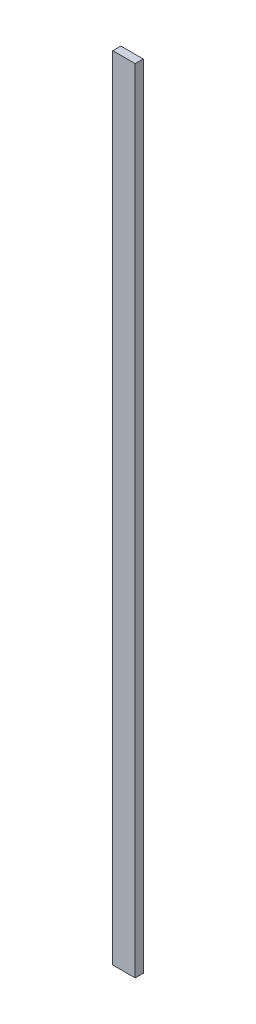
ISO-10303-21;
HEADER;
FILE_DESCRIPTION(('STEP AP214'),'2;1');
FILE_NAME('part.step','',(''),(''),'','','');
FILE_SCHEMA(('AUTOMOTIVE_DESIGN { 1 0 10303 214 1 1 1 1 }'));
ENDSEC;
DATA;
#1=APPLICATION_CONTEXT('core data for automotive mechanical design processes');
#2=APPLICATION_PROTOCOL_DEFINITION('international standard','automotive_design',2000,#1);
#3=PRODUCT_CONTEXT('',#1,'mechanical');
#4=PRODUCT('Part','Part','',(#3));
#5=PRODUCT_RELATED_PRODUCT_CATEGORY('part','',(#4));
#6=PRODUCT_DEFINITION_FORMATION('','',#4);
#7=PRODUCT_DEFINITION_CONTEXT('part definition',#1,'design');
#8=PRODUCT_DEFINITION('design','',#6,#7);
#9=PRODUCT_DEFINITION_SHAPE('','',#8);
#10=(LENGTH_UNIT() NAMED_UNIT(*) SI_UNIT(.MILLI.,.METRE.));
#11=(NAMED_UNIT(*) PLANE_ANGLE_UNIT() SI_UNIT($,.RADIAN.));
#12=(NAMED_UNIT(*) SI_UNIT($,.STERADIAN.) SOLID_ANGLE_UNIT());
#13=UNCERTAINTY_MEASURE_WITH_UNIT(LENGTH_MEASURE(1.E-05),#10,'distance_accuracy_value','');
#14=(GEOMETRIC_REPRESENTATION_CONTEXT(3) GLOBAL_UNCERTAINTY_ASSIGNED_CONTEXT((#13)) GLOBAL_UNIT_ASSIGNED_CONTEXT((#10,
#11,#12)) REPRESENTATION_CONTEXT('',''));
#15=CARTESIAN_POINT('',(0.,0.,0.));
#16=DIRECTION('',(0.,0.,1.));
#17=DIRECTION('',(1.,0.,0.));
#18=AXIS2_PLACEMENT_3D('',#15,#16,#17);
#19=CARTESIAN_POINT('',(25.4,-896.14375,18.25625));
#20=DIRECTION('',(-1.,0.,0.));
#21=DIRECTION('',(0.,0.,1.));
#22=AXIS2_PLACEMENT_3D('',#19,#20,#21);
#23=PLANE('',#22);
#24=DIRECTION('',(0.,1.,0.));
#25=VECTOR('',#24,1.);
#26=CARTESIAN_POINT('',(25.4,-896.14375,0.));
#27=LINE('',#26,#25);
#28=CARTESIAN_POINT('',(25.4,-896.14375,0.));
#29=VERTEX_POINT('',#28);
#30=CARTESIAN_POINT('',(25.4,896.14375,0.));
#31=VERTEX_POINT('',#30);
#32=EDGE_CURVE('E107',#29,#31,#27,.T.);
#33=ORIENTED_EDGE('',*,*,#32,.T.);
#34=DIRECTION('',(0.,0.,-1.));
#35=VECTOR('',#34,1.);
#36=CARTESIAN_POINT('',(25.4,896.14375,18.25625));
#37=LINE('',#36,#35);
#38=CARTESIAN_POINT('',(25.4,896.14375,18.25625));
#39=VERTEX_POINT('',#38);
#40=EDGE_CURVE('E11',#39,#31,#37,.T.);
#41=ORIENTED_EDGE('',*,*,#40,.F.);
#42=DIRECTION('',(0.,1.,0.));
#43=VECTOR('',#42,1.);
#44=CARTESIAN_POINT('',(25.4,-896.14375,18.25625));
#45=LINE('',#44,#43);
#46=CARTESIAN_POINT('',(25.4,-896.14375,18.25625));
#47=VERTEX_POINT('',#46);
#48=EDGE_CURVE('E91',#47,#39,#45,.T.);
#49=ORIENTED_EDGE('',*,*,#48,.F.);
#50=DIRECTION('',(0.,0.,-1.));
#51=VECTOR('',#50,1.);
#52=CARTESIAN_POINT('',(25.4,-896.14375,18.25625));
#53=LINE('',#52,#51);
#54=EDGE_CURVE('E103',#47,#29,#53,.T.);
#55=ORIENTED_EDGE('',*,*,#54,.T.);
#56=EDGE_LOOP('',(#33,#41,#49,#55));
#57=FACE_BOUND('',#56,.T.);
#58=ADVANCED_FACE('F39',(#57),#23,.F.);
#59=CARTESIAN_POINT('',(-25.4,896.14375,18.25625));
#60=DIRECTION('',(0.,-1.,0.));
#61=DIRECTION('',(0.,0.,-1.));
#62=AXIS2_PLACEMENT_3D('',#59,#60,#61);
#63=PLANE('',#62);
#64=DIRECTION('',(-1.,0.,0.));
#65=VECTOR('',#64,1.);
#66=CARTESIAN_POINT('',(-25.4,896.14375,0.));
#67=LINE('',#66,#65);
#68=CARTESIAN_POINT('',(-25.4,896.14375,0.));
#69=VERTEX_POINT('',#68);
#70=EDGE_CURVE('E96',#31,#69,#67,.T.);
#71=ORIENTED_EDGE('',*,*,#70,.T.);
#72=DIRECTION('',(0.,0.,-1.));
#73=VECTOR('',#72,1.);
#74=CARTESIAN_POINT('',(-25.4,896.14375,18.25625));
#75=LINE('',#74,#73);
#76=CARTESIAN_POINT('',(-25.4,896.14375,18.25625));
#77=VERTEX_POINT('',#76);
#78=EDGE_CURVE('E48',#77,#69,#75,.T.);
#79=ORIENTED_EDGE('',*,*,#78,.F.);
#80=DIRECTION('',(-1.,0.,0.));
#81=VECTOR('',#80,1.);
#82=CARTESIAN_POINT('',(-25.4,896.14375,18.25625));
#83=LINE('',#82,#81);
#84=EDGE_CURVE('E86',#39,#77,#83,.T.);
#85=ORIENTED_EDGE('',*,*,#84,.F.);
#86=ORIENTED_EDGE('',*,*,#40,.T.);
#87=EDGE_LOOP('',(#71,#79,#85,#86));
#88=FACE_BOUND('',#87,.T.);
#89=ADVANCED_FACE('F95',(#88),#63,.F.);
#90=CARTESIAN_POINT('',(-25.4,-896.14375,18.25625));
#91=DIRECTION('',(1.,0.,0.));
#92=DIRECTION('',(0.,0.,-1.));
#93=AXIS2_PLACEMENT_3D('',#90,#91,#92);
#94=PLANE('',#93);
#95=DIRECTION('',(0.,-1.,0.));
#96=VECTOR('',#95,1.);
#97=CARTESIAN_POINT('',(-25.4,-896.14375,0.));
#98=LINE('',#97,#96);
#99=CARTESIAN_POINT('',(-25.4,-896.14375,0.));
#100=VERTEX_POINT('',#99);
#101=EDGE_CURVE('E73',#69,#100,#98,.T.);
#102=ORIENTED_EDGE('',*,*,#101,.T.);
#103=DIRECTION('',(0.,0.,-1.));
#104=VECTOR('',#103,1.);
#105=CARTESIAN_POINT('',(-25.4,-896.14375,18.25625));
#106=LINE('',#105,#104);
#107=CARTESIAN_POINT('',(-25.4,-896.14375,18.25625));
#108=VERTEX_POINT('',#107);
#109=EDGE_CURVE('E98',#108,#100,#106,.T.);
#110=ORIENTED_EDGE('',*,*,#109,.F.);
#111=DIRECTION('',(0.,-1.,0.));
#112=VECTOR('',#111,1.);
#113=CARTESIAN_POINT('',(-25.4,-896.14375,18.25625));
#114=LINE('',#113,#112);
#115=EDGE_CURVE('E89',#77,#108,#114,.T.);
#116=ORIENTED_EDGE('',*,*,#115,.F.);
#117=ORIENTED_EDGE('',*,*,#78,.T.);
#118=EDGE_LOOP('',(#102,#110,#116,#117));
#119=FACE_BOUND('',#118,.T.);
#120=ADVANCED_FACE('F99',(#119),#94,.F.);
#121=CARTESIAN_POINT('',(-25.4,-896.14375,18.25625));
#122=DIRECTION('',(0.,1.,0.));
#123=DIRECTION('',(0.,0.,1.));
#124=AXIS2_PLACEMENT_3D('',#121,#122,#123);
#125=PLANE('',#124);
#126=DIRECTION('',(1.,0.,0.));
#127=VECTOR('',#126,1.);
#128=CARTESIAN_POINT('',(-25.4,-896.14375,0.));
#129=LINE('',#128,#127);
#130=EDGE_CURVE('E79',#100,#29,#129,.T.);
#131=ORIENTED_EDGE('',*,*,#130,.T.);
#132=ORIENTED_EDGE('',*,*,#54,.F.);
#133=DIRECTION('',(1.,0.,0.));
#134=VECTOR('',#133,1.);
#135=CARTESIAN_POINT('',(-25.4,-896.14375,18.25625));
#136=LINE('',#135,#134);
#137=EDGE_CURVE('E56',#108,#47,#136,.T.);
#138=ORIENTED_EDGE('',*,*,#137,.F.);
#139=ORIENTED_EDGE('',*,*,#109,.T.);
#140=EDGE_LOOP('',(#131,#132,#138,#139));
#141=FACE_BOUND('',#140,.T.);
#142=ADVANCED_FACE('F120',(#141),#125,.F.);
#143=CARTESIAN_POINT('',(0.,0.,18.25625));
#144=DIRECTION('',(0.,0.,-1.));
#145=DIRECTION('',(-1.,0.,0.));
#146=AXIS2_PLACEMENT_3D('',#143,#144,#145);
#147=PLANE('',#146);
#148=ORIENTED_EDGE('',*,*,#48,.T.);
#149=ORIENTED_EDGE('',*,*,#84,.T.);
#150=ORIENTED_EDGE('',*,*,#115,.T.);
#151=ORIENTED_EDGE('',*,*,#137,.T.);
#152=EDGE_LOOP('',(#148,#149,#150,#151));
#153=FACE_BOUND('',#152,.T.);
#154=ADVANCED_FACE('F87',(#153),#147,.F.);
#155=CARTESIAN_POINT('',(0.,0.,0.));
#156=DIRECTION('',(0.,0.,-1.));
#157=DIRECTION('',(-1.,0.,0.));
#158=AXIS2_PLACEMENT_3D('',#155,#156,#157);
#159=PLANE('',#158);
#160=ORIENTED_EDGE('',*,*,#32,.F.);
#161=ORIENTED_EDGE('',*,*,#130,.F.);
#162=ORIENTED_EDGE('',*,*,#101,.F.);
#163=ORIENTED_EDGE('',*,*,#70,.F.);
#164=EDGE_LOOP('',(#160,#161,#162,#163));
#165=FACE_BOUND('',#164,.T.);
#166=ADVANCED_FACE('F123',(#165),#159,.T.);
#167=CLOSED_SHELL('',(#58,#89,#120,#142,#154,#166));
#168=MANIFOLD_SOLID_BREP('B2',#167);
#169=ADVANCED_BREP_SHAPE_REPRESENTATION('',(#18,#168),#14);
#170=SHAPE_DEFINITION_REPRESENTATION(#9,#169);
ENDSEC;
END-ISO-10303-21;
